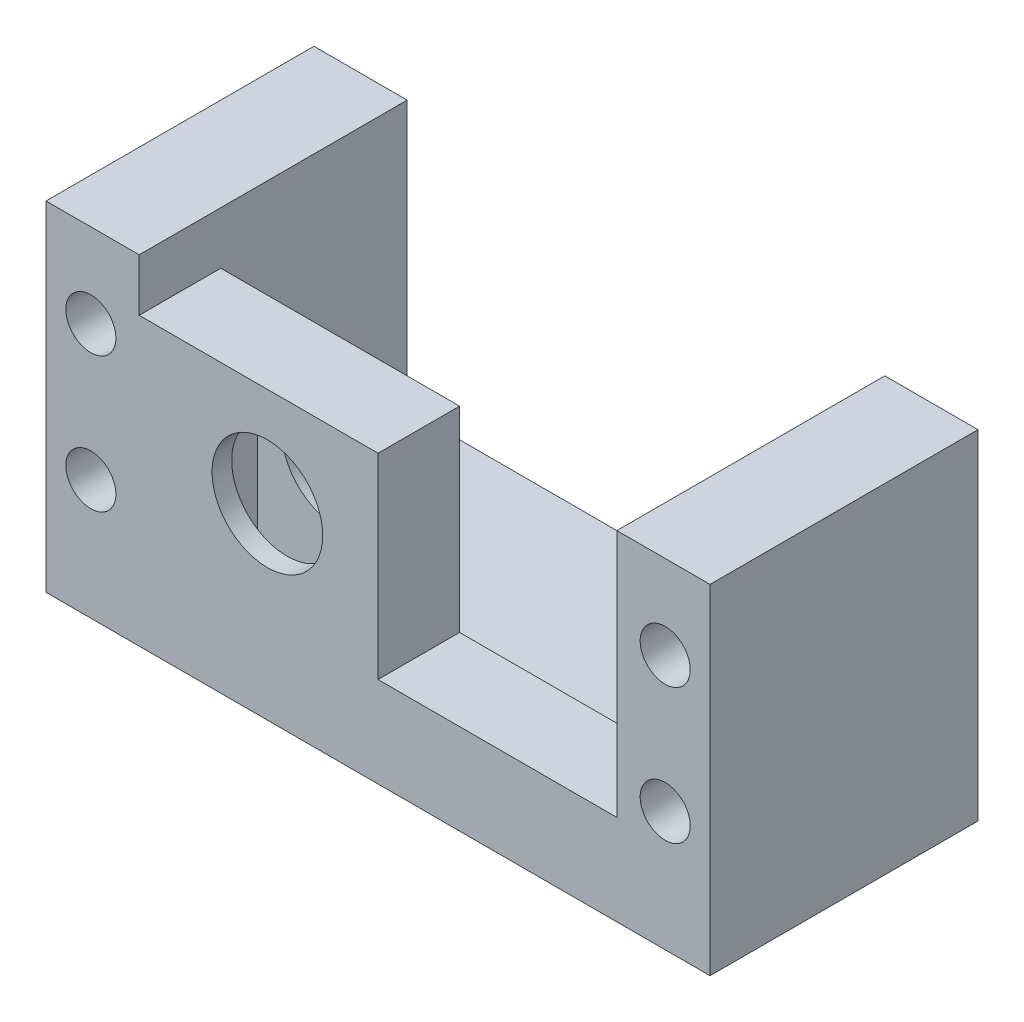
ISO-10303-21;
HEADER;
FILE_DESCRIPTION(('STEP AP214'),'2;1');
FILE_NAME('part.step','',(''),(''),'','','');
FILE_SCHEMA(('AUTOMOTIVE_DESIGN { 1 0 10303 214 1 1 1 1 }'));
ENDSEC;
DATA;
#1=APPLICATION_CONTEXT('core data for automotive mechanical design processes');
#2=APPLICATION_PROTOCOL_DEFINITION('international standard','automotive_design',2000,#1);
#3=PRODUCT_CONTEXT('',#1,'mechanical');
#4=PRODUCT('Part','Part','',(#3));
#5=PRODUCT_RELATED_PRODUCT_CATEGORY('part','',(#4));
#6=PRODUCT_DEFINITION_FORMATION('','',#4);
#7=PRODUCT_DEFINITION_CONTEXT('part definition',#1,'design');
#8=PRODUCT_DEFINITION('design','',#6,#7);
#9=PRODUCT_DEFINITION_SHAPE('','',#8);
#10=(LENGTH_UNIT() NAMED_UNIT(*) SI_UNIT(.MILLI.,.METRE.));
#11=(NAMED_UNIT(*) PLANE_ANGLE_UNIT() SI_UNIT($,.RADIAN.));
#12=(NAMED_UNIT(*) SI_UNIT($,.STERADIAN.) SOLID_ANGLE_UNIT());
#13=UNCERTAINTY_MEASURE_WITH_UNIT(LENGTH_MEASURE(1.E-05),#10,'distance_accuracy_value','');
#14=(GEOMETRIC_REPRESENTATION_CONTEXT(3) GLOBAL_UNCERTAINTY_ASSIGNED_CONTEXT((#13)) GLOBAL_UNIT_ASSIGNED_CONTEXT((#10,
#11,#12)) REPRESENTATION_CONTEXT('',''));
#15=CARTESIAN_POINT('',(0.,0.,0.));
#16=DIRECTION('',(0.,0.,1.));
#17=DIRECTION('',(1.,0.,0.));
#18=AXIS2_PLACEMENT_3D('',#15,#16,#17);
#19=CARTESIAN_POINT('',(-40.1905617977528,-28.0857303370787,16.));
#20=DIRECTION('',(0.,0.,1.));
#21=DIRECTION('',(1.,0.,0.));
#22=AXIS2_PLACEMENT_3D('',#19,#20,#21);
#23=CYLINDRICAL_SURFACE('',#22,4.75);
#24=CARTESIAN_POINT('',(-40.1905617977528,-28.0857303370787,21.3128854980334));
#25=DIRECTION('',(0.,0.,1.));
#26=DIRECTION('',(1.,0.,0.));
#27=AXIS2_PLACEMENT_3D('',#24,#25,#26);
#28=CIRCLE('',#27,4.75);
#29=CARTESIAN_POINT('',(-35.4405617977528,-28.0857303370787,21.3128854980334));
#30=VERTEX_POINT('',#29);
#31=EDGE_CURVE('E37',#30,#30,#28,.F.);
#32=ORIENTED_EDGE('',*,*,#31,.T.);
#33=EDGE_LOOP('',(#32));
#34=FACE_BOUND('',#33,.T.);
#35=CARTESIAN_POINT('',(-40.1905617977528,-28.0857303370787,23.));
#36=DIRECTION('',(0.,0.,1.));
#37=DIRECTION('',(-1.,0.,0.));
#38=AXIS2_PLACEMENT_3D('',#35,#36,#37);
#39=CIRCLE('',#38,4.75);
#40=CARTESIAN_POINT('',(-44.9405617977528,-28.0857303370787,23.));
#41=VERTEX_POINT('',#40);
#42=EDGE_CURVE('E225',#41,#41,#39,.T.);
#43=ORIENTED_EDGE('',*,*,#42,.T.);
#44=EDGE_LOOP('',(#43));
#45=FACE_BOUND('',#44,.T.);
#46=ADVANCED_FACE('F33',(#34,#45),#23,.F.);
#47=CARTESIAN_POINT('',(0.,0.,23.));
#48=DIRECTION('',(0.,0.,1.));
#49=DIRECTION('',(1.,0.,0.));
#50=AXIS2_PLACEMENT_3D('',#47,#48,#49);
#51=PLANE('',#50);
#52=DIRECTION('',(0.,-1.,0.));
#53=VECTOR('',#52,1.);
#54=CARTESIAN_POINT('',(-10.1905617977528,-15.0857303370787,23.));
#55=LINE('',#54,#53);
#56=CARTESIAN_POINT('',(-10.1905617977528,-15.0857303370787,23.));
#57=VERTEX_POINT('',#56);
#58=CARTESIAN_POINT('',(-10.1905617977528,-36.4088158931472,23.));
#59=VERTEX_POINT('',#58);
#60=EDGE_CURVE('E253',#57,#59,#55,.T.);
#61=ORIENTED_EDGE('',*,*,#60,.T.);
#62=DIRECTION('',(1.,0.,0.));
#63=VECTOR('',#62,1.);
#64=CARTESIAN_POINT('',(-10.1905617977528,-36.4088158931472,23.));
#65=LINE('',#64,#63);
#66=CARTESIAN_POINT('',(-30.6905617977528,-36.4088158931472,23.));
#67=VERTEX_POINT('',#66);
#68=EDGE_CURVE('E196',#67,#59,#65,.T.);
#69=ORIENTED_EDGE('',*,*,#68,.F.);
#70=DIRECTION('',(0.,-1.,0.));
#71=VECTOR('',#70,1.);
#72=CARTESIAN_POINT('',(-30.6905617977528,-19.58573034,23.));
#73=LINE('',#72,#71);
#74=CARTESIAN_POINT('',(-30.6905617977528,-19.58573034,23.));
#75=VERTEX_POINT('',#74);
#76=EDGE_CURVE('E194',#75,#67,#73,.T.);
#77=ORIENTED_EDGE('',*,*,#76,.F.);
#78=DIRECTION('',(-1.,0.,0.));
#79=VECTOR('',#78,1.);
#80=CARTESIAN_POINT('',(-21.1905617977528,-19.58573034,23.));
#81=LINE('',#80,#79);
#82=CARTESIAN_POINT('',(-51.1905617977528,-19.58573034,23.));
#83=VERTEX_POINT('',#82);
#84=EDGE_CURVE('E231',#75,#83,#81,.T.);
#85=ORIENTED_EDGE('',*,*,#84,.T.);
#86=DIRECTION('',(0.,1.,0.));
#87=VECTOR('',#86,1.);
#88=CARTESIAN_POINT('',(-51.1905617977528,-15.0857303370787,23.));
#89=LINE('',#88,#87);
#90=CARTESIAN_POINT('',(-51.1905617977528,-15.0857303370787,23.));
#91=VERTEX_POINT('',#90);
#92=EDGE_CURVE('E256',#83,#91,#89,.T.);
#93=ORIENTED_EDGE('',*,*,#92,.T.);
#94=DIRECTION('',(-1.,0.,0.));
#95=VECTOR('',#94,1.);
#96=CARTESIAN_POINT('',(-59.1905617977528,-15.0857303370787,23.));
#97=LINE('',#96,#95);
#98=CARTESIAN_POINT('',(-59.1905617977528,-15.0857303370787,23.));
#99=VERTEX_POINT('',#98);
#100=EDGE_CURVE('E258',#91,#99,#97,.T.);
#101=ORIENTED_EDGE('',*,*,#100,.T.);
#102=DIRECTION('',(0.,-1.,0.));
#103=VECTOR('',#102,1.);
#104=CARTESIAN_POINT('',(-59.1905617977528,-40.176897726885,23.));
#105=LINE('',#104,#103);
#106=CARTESIAN_POINT('',(-59.1905617977528,-44.176897726885,23.));
#107=VERTEX_POINT('',#106);
#108=EDGE_CURVE('E260',#99,#107,#105,.T.);
#109=ORIENTED_EDGE('',*,*,#108,.T.);
#110=DIRECTION('',(1.,0.,0.));
#111=VECTOR('',#110,1.);
#112=CARTESIAN_POINT('',(-59.1905617977528,-44.176897726885,23.));
#113=LINE('',#112,#111);
#114=CARTESIAN_POINT('',(-2.19056179775284,-44.176897726885,23.));
#115=VERTEX_POINT('',#114);
#116=EDGE_CURVE('E262',#107,#115,#113,.T.);
#117=ORIENTED_EDGE('',*,*,#116,.T.);
#118=DIRECTION('',(0.,1.,0.));
#119=VECTOR('',#118,1.);
#120=CARTESIAN_POINT('',(-2.19056179775284,-44.176897726885,23.));
#121=LINE('',#120,#119);
#122=CARTESIAN_POINT('',(-2.19056179775284,-15.0857303370787,23.));
#123=VERTEX_POINT('',#122);
#124=EDGE_CURVE('E264',#115,#123,#121,.T.);
#125=ORIENTED_EDGE('',*,*,#124,.T.);
#126=DIRECTION('',(-1.,0.,0.));
#127=VECTOR('',#126,1.);
#128=CARTESIAN_POINT('',(-2.19056179775284,-15.0857303370787,23.));
#129=LINE('',#128,#127);
#130=EDGE_CURVE('E250',#123,#57,#129,.T.);
#131=ORIENTED_EDGE('',*,*,#130,.T.);
#132=EDGE_LOOP('',(#61,#69,#77,#85,#93,#101,#109,#117,#125,#131));
#133=FACE_BOUND('',#132,.T.);
#134=CARTESIAN_POINT('',(-6.04056179775284,-22.2857303370787,23.));
#135=DIRECTION('',(0.,0.,1.));
#136=DIRECTION('',(1.,0.,0.));
#137=AXIS2_PLACEMENT_3D('',#134,#135,#136);
#138=CIRCLE('',#137,2.15);
#139=CARTESIAN_POINT('',(-3.89056179775284,-22.2857303370787,23.));
#140=VERTEX_POINT('',#139);
#141=EDGE_CURVE('E214',#140,#140,#138,.T.);
#142=ORIENTED_EDGE('',*,*,#141,.F.);
#143=EDGE_LOOP('',(#142));
#144=FACE_BOUND('',#143,.T.);
#145=CARTESIAN_POINT('',(-55.3405617977528,-22.2857303370787,23.));
#146=DIRECTION('',(0.,0.,1.));
#147=DIRECTION('',(1.,0.,0.));
#148=AXIS2_PLACEMENT_3D('',#145,#146,#147);
#149=CIRCLE('',#148,2.15);
#150=CARTESIAN_POINT('',(-53.1905617977528,-22.2857303370787,23.));
#151=VERTEX_POINT('',#150);
#152=EDGE_CURVE('E193',#151,#151,#149,.F.);
#153=ORIENTED_EDGE('',*,*,#152,.T.);
#154=EDGE_LOOP('',(#153));
#155=FACE_BOUND('',#154,.T.);
#156=CARTESIAN_POINT('',(-6.04056179775284,-33.8857303370787,23.));
#157=DIRECTION('',(0.,0.,1.));
#158=DIRECTION('',(1.,0.,0.));
#159=AXIS2_PLACEMENT_3D('',#156,#157,#158);
#160=CIRCLE('',#159,2.15);
#161=CARTESIAN_POINT('',(-3.89056179775284,-33.8857303370787,23.));
#162=VERTEX_POINT('',#161);
#163=EDGE_CURVE('E213',#162,#162,#160,.T.);
#164=ORIENTED_EDGE('',*,*,#163,.F.);
#165=EDGE_LOOP('',(#164));
#166=FACE_BOUND('',#165,.T.);
#167=ORIENTED_EDGE('',*,*,#42,.F.);
#168=EDGE_LOOP('',(#167));
#169=FACE_BOUND('',#168,.T.);
#170=CARTESIAN_POINT('',(-55.3405617977528,-33.8857303370787,23.));
#171=DIRECTION('',(0.,0.,1.));
#172=DIRECTION('',(1.,0.,0.));
#173=AXIS2_PLACEMENT_3D('',#170,#171,#172);
#174=CIRCLE('',#173,2.15);
#175=CARTESIAN_POINT('',(-53.1905617977528,-33.8857303370787,23.));
#176=VERTEX_POINT('',#175);
#177=EDGE_CURVE('E207',#176,#176,#174,.F.);
#178=ORIENTED_EDGE('',*,*,#177,.T.);
#179=EDGE_LOOP('',(#178));
#180=FACE_BOUND('',#179,.T.);
#181=ADVANCED_FACE('F325',(#133,#144,#155,#166,#169,#180),#51,.T.);
#182=CARTESIAN_POINT('',(0.,0.,0.));
#183=DIRECTION('',(0.,0.,1.));
#184=DIRECTION('',(1.,0.,0.));
#185=AXIS2_PLACEMENT_3D('',#182,#183,#184);
#186=PLANE('',#185);
#187=CARTESIAN_POINT('',(-6.04056179775284,-22.2857303370787,0.));
#188=DIRECTION('',(0.,0.,1.));
#189=DIRECTION('',(1.,0.,0.));
#190=AXIS2_PLACEMENT_3D('',#187,#188,#189);
#191=CIRCLE('',#190,2.15);
#192=CARTESIAN_POINT('',(-3.89056179775284,-22.2857303370787,0.));
#193=VERTEX_POINT('',#192);
#194=EDGE_CURVE('E210',#193,#193,#191,.T.);
#195=ORIENTED_EDGE('',*,*,#194,.T.);
#196=EDGE_LOOP('',(#195));
#197=FACE_BOUND('',#196,.T.);
#198=CARTESIAN_POINT('',(-6.04056179775284,-33.8857303370787,0.));
#199=DIRECTION('',(0.,0.,1.));
#200=DIRECTION('',(1.,0.,0.));
#201=AXIS2_PLACEMENT_3D('',#198,#199,#200);
#202=CIRCLE('',#201,2.15);
#203=CARTESIAN_POINT('',(-3.89056179775284,-33.8857303370787,0.));
#204=VERTEX_POINT('',#203);
#205=EDGE_CURVE('E222',#204,#204,#202,.T.);
#206=ORIENTED_EDGE('',*,*,#205,.T.);
#207=EDGE_LOOP('',(#206));
#208=FACE_BOUND('',#207,.T.);
#209=DIRECTION('',(-1.,0.,0.));
#210=VECTOR('',#209,1.);
#211=CARTESIAN_POINT('',(-2.19056179775284,-15.0857303370787,0.));
#212=LINE('',#211,#210);
#213=CARTESIAN_POINT('',(-2.19056179775284,-15.0857303370787,0.));
#214=VERTEX_POINT('',#213);
#215=CARTESIAN_POINT('',(-10.1905617977528,-15.0857303370787,0.));
#216=VERTEX_POINT('',#215);
#217=EDGE_CURVE('E249',#214,#216,#212,.T.);
#218=ORIENTED_EDGE('',*,*,#217,.F.);
#219=DIRECTION('',(0.,1.,0.));
#220=VECTOR('',#219,1.);
#221=CARTESIAN_POINT('',(-2.19056179775284,-38.0857303370787,0.));
#222=LINE('',#221,#220);
#223=CARTESIAN_POINT('',(-2.19056179775284,-44.176897726885,0.));
#224=VERTEX_POINT('',#223);
#225=EDGE_CURVE('E254',#224,#214,#222,.T.);
#226=ORIENTED_EDGE('',*,*,#225,.F.);
#227=DIRECTION('',(1.,0.,0.));
#228=VECTOR('',#227,1.);
#229=CARTESIAN_POINT('',(-59.1905617977528,-44.176897726885,0.));
#230=LINE('',#229,#228);
#231=CARTESIAN_POINT('',(-59.1905617977528,-44.176897726885,0.));
#232=VERTEX_POINT('',#231);
#233=EDGE_CURVE('E282',#232,#224,#230,.T.);
#234=ORIENTED_EDGE('',*,*,#233,.F.);
#235=DIRECTION('',(0.,-1.,0.));
#236=VECTOR('',#235,1.);
#237=CARTESIAN_POINT('',(-59.1905617977528,-40.176897726885,0.));
#238=LINE('',#237,#236);
#239=CARTESIAN_POINT('',(-59.1905617977528,-15.0857303370787,0.));
#240=VERTEX_POINT('',#239);
#241=EDGE_CURVE('E280',#240,#232,#238,.T.);
#242=ORIENTED_EDGE('',*,*,#241,.F.);
#243=DIRECTION('',(-1.,0.,0.));
#244=VECTOR('',#243,1.);
#245=CARTESIAN_POINT('',(-59.1905617977528,-15.0857303370787,0.));
#246=LINE('',#245,#244);
#247=CARTESIAN_POINT('',(-51.1905617977528,-15.0857303370787,0.));
#248=VERTEX_POINT('',#247);
#249=EDGE_CURVE('E277',#248,#240,#246,.T.);
#250=ORIENTED_EDGE('',*,*,#249,.F.);
#251=DIRECTION('',(0.,1.,0.));
#252=VECTOR('',#251,1.);
#253=CARTESIAN_POINT('',(-51.1905617977528,-15.0857303370787,0.));
#254=LINE('',#253,#252);
#255=CARTESIAN_POINT('',(-51.1905617977528,-38.0857303370787,0.));
#256=VERTEX_POINT('',#255);
#257=EDGE_CURVE('E275',#256,#248,#254,.T.);
#258=ORIENTED_EDGE('',*,*,#257,.F.);
#259=DIRECTION('',(-1.,0.,0.));
#260=VECTOR('',#259,1.);
#261=CARTESIAN_POINT('',(-51.1905617977528,-38.0857303370787,0.));
#262=LINE('',#261,#260);
#263=CARTESIAN_POINT('',(-10.1905617977528,-38.0857303370787,0.));
#264=VERTEX_POINT('',#263);
#265=EDGE_CURVE('E272',#264,#256,#262,.T.);
#266=ORIENTED_EDGE('',*,*,#265,.F.);
#267=DIRECTION('',(0.,-1.,0.));
#268=VECTOR('',#267,1.);
#269=CARTESIAN_POINT('',(-10.1905617977528,-15.0857303370787,0.));
#270=LINE('',#269,#268);
#271=EDGE_CURVE('E269',#216,#264,#270,.T.);
#272=ORIENTED_EDGE('',*,*,#271,.F.);
#273=EDGE_LOOP('',(#218,#226,#234,#242,#250,#258,#266,#272));
#274=FACE_BOUND('',#273,.T.);
#275=CARTESIAN_POINT('',(-55.3405617977528,-22.2857303370787,0.));
#276=DIRECTION('',(0.,0.,1.));
#277=DIRECTION('',(1.,0.,0.));
#278=AXIS2_PLACEMENT_3D('',#275,#276,#277);
#279=CIRCLE('',#278,2.15);
#280=CARTESIAN_POINT('',(-53.1905617977528,-22.2857303370787,0.));
#281=VERTEX_POINT('',#280);
#282=EDGE_CURVE('E204',#281,#281,#279,.F.);
#283=ORIENTED_EDGE('',*,*,#282,.F.);
#284=EDGE_LOOP('',(#283));
#285=FACE_BOUND('',#284,.T.);
#286=CARTESIAN_POINT('',(-55.3405617977528,-33.8857303370787,0.));
#287=DIRECTION('',(0.,0.,1.));
#288=DIRECTION('',(1.,0.,0.));
#289=AXIS2_PLACEMENT_3D('',#286,#287,#288);
#290=CIRCLE('',#289,2.15);
#291=CARTESIAN_POINT('',(-53.1905617977528,-33.8857303370787,0.));
#292=VERTEX_POINT('',#291);
#293=EDGE_CURVE('E217',#292,#292,#290,.F.);
#294=ORIENTED_EDGE('',*,*,#293,.F.);
#295=EDGE_LOOP('',(#294));
#296=FACE_BOUND('',#295,.T.);
#297=ADVANCED_FACE('F331',(#197,#208,#274,#285,#296),#186,.F.);
#298=CARTESIAN_POINT('',(-51.1905617977528,-38.0857303370787,23.));
#299=DIRECTION('',(0.,-1.,0.));
#300=DIRECTION('',(0.,0.,-1.));
#301=AXIS2_PLACEMENT_3D('',#298,#299,#300);
#302=PLANE('',#301);
#303=DIRECTION('',(1.,0.,0.));
#304=VECTOR('',#303,1.);
#305=CARTESIAN_POINT('',(-10.1905617977528,-38.0857303370787,16.));
#306=LINE('',#305,#304);
#307=CARTESIAN_POINT('',(-51.1905617977528,-38.0857303370787,16.));
#308=VERTEX_POINT('',#307);
#309=CARTESIAN_POINT('',(-10.1905617977528,-38.0857303370787,16.));
#310=VERTEX_POINT('',#309);
#311=EDGE_CURVE('E237',#308,#310,#306,.T.);
#312=ORIENTED_EDGE('',*,*,#311,.T.);
#313=DIRECTION('',(0.,0.,-1.));
#314=VECTOR('',#313,1.);
#315=CARTESIAN_POINT('',(-10.1905617977528,-38.0857303370787,23.));
#316=LINE('',#315,#314);
#317=EDGE_CURVE('E42',#310,#264,#316,.T.);
#318=ORIENTED_EDGE('',*,*,#317,.T.);
#319=ORIENTED_EDGE('',*,*,#265,.T.);
#320=DIRECTION('',(0.,0.,-1.));
#321=VECTOR('',#320,1.);
#322=CARTESIAN_POINT('',(-51.1905617977528,-38.0857303370787,23.));
#323=LINE('',#322,#321);
#324=EDGE_CURVE('E300',#308,#256,#323,.T.);
#325=ORIENTED_EDGE('',*,*,#324,.F.);
#326=EDGE_LOOP('',(#312,#318,#319,#325));
#327=FACE_BOUND('',#326,.T.);
#328=ADVANCED_FACE('F369',(#327),#302,.F.);
#329=CARTESIAN_POINT('',(-2.19056179775284,-15.0857303370787,23.));
#330=DIRECTION('',(0.,-1.,0.));
#331=DIRECTION('',(1.,0.,0.));
#332=AXIS2_PLACEMENT_3D('',#329,#330,#331);
#333=PLANE('',#332);
#334=ORIENTED_EDGE('',*,*,#217,.T.);
#335=DIRECTION('',(0.,0.,-1.));
#336=VECTOR('',#335,1.);
#337=CARTESIAN_POINT('',(-10.1905617977528,-15.0857303370787,23.));
#338=LINE('',#337,#336);
#339=EDGE_CURVE('E11',#57,#216,#338,.T.);
#340=ORIENTED_EDGE('',*,*,#339,.F.);
#341=ORIENTED_EDGE('',*,*,#130,.F.);
#342=DIRECTION('',(0.,0.,-1.));
#343=VECTOR('',#342,1.);
#344=CARTESIAN_POINT('',(-2.19056179775284,-15.0857303370787,23.));
#345=LINE('',#344,#343);
#346=EDGE_CURVE('E266',#123,#214,#345,.T.);
#347=ORIENTED_EDGE('',*,*,#346,.T.);
#348=EDGE_LOOP('',(#334,#340,#341,#347));
#349=FACE_BOUND('',#348,.T.);
#350=ADVANCED_FACE('F35',(#349),#333,.F.);
#351=CARTESIAN_POINT('',(-10.1905617977528,-15.0857303370787,23.));
#352=DIRECTION('',(1.,0.,0.));
#353=DIRECTION('',(0.,1.,0.));
#354=AXIS2_PLACEMENT_3D('',#351,#352,#353);
#355=PLANE('',#354);
#356=DIRECTION('',(0.,0.,1.));
#357=VECTOR('',#356,1.);
#358=CARTESIAN_POINT('',(-10.1905617977528,-36.4088158931472,-10.5191667955181));
#359=LINE('',#358,#357);
#360=CARTESIAN_POINT('',(-10.1905617977528,-36.4088158931472,16.));
#361=VERTEX_POINT('',#360);
#362=EDGE_CURVE('E191',#361,#59,#359,.T.);
#363=ORIENTED_EDGE('',*,*,#362,.T.);
#364=ORIENTED_EDGE('',*,*,#60,.F.);
#365=ORIENTED_EDGE('',*,*,#339,.T.);
#366=ORIENTED_EDGE('',*,*,#271,.T.);
#367=ORIENTED_EDGE('',*,*,#317,.F.);
#368=DIRECTION('',(0.,1.,0.));
#369=VECTOR('',#368,1.);
#370=CARTESIAN_POINT('',(-10.1905617977528,-38.0857303370787,16.));
#371=LINE('',#370,#369);
#372=EDGE_CURVE('E240',#310,#361,#371,.T.);
#373=ORIENTED_EDGE('',*,*,#372,.T.);
#374=EDGE_LOOP('',(#363,#364,#365,#366,#367,#373));
#375=FACE_BOUND('',#374,.T.);
#376=ADVANCED_FACE('F365',(#375),#355,.F.);
#377=CARTESIAN_POINT('',(-51.1905617977528,-15.0857303370787,23.));
#378=DIRECTION('',(-1.,0.,0.));
#379=DIRECTION('',(0.,-1.,0.));
#380=AXIS2_PLACEMENT_3D('',#377,#378,#379);
#381=PLANE('',#380);
#382=ORIENTED_EDGE('',*,*,#92,.F.);
#383=DIRECTION('',(0.,0.,1.));
#384=VECTOR('',#383,1.);
#385=CARTESIAN_POINT('',(-51.1905617977528,-19.58573034,16.));
#386=LINE('',#385,#384);
#387=CARTESIAN_POINT('',(-51.1905617977528,-19.58573034,16.));
#388=VERTEX_POINT('',#387);
#389=EDGE_CURVE('E245',#388,#83,#386,.T.);
#390=ORIENTED_EDGE('',*,*,#389,.F.);
#391=DIRECTION('',(0.,-1.,0.));
#392=VECTOR('',#391,1.);
#393=CARTESIAN_POINT('',(-51.1905617977528,-34.9839297426522,16.));
#394=LINE('',#393,#392);
#395=EDGE_CURVE('E234',#388,#308,#394,.T.);
#396=ORIENTED_EDGE('',*,*,#395,.T.);
#397=ORIENTED_EDGE('',*,*,#324,.T.);
#398=ORIENTED_EDGE('',*,*,#257,.T.);
#399=DIRECTION('',(0.,0.,-1.));
#400=VECTOR('',#399,1.);
#401=CARTESIAN_POINT('',(-51.1905617977528,-15.0857303370787,23.));
#402=LINE('',#401,#400);
#403=EDGE_CURVE('E297',#91,#248,#402,.T.);
#404=ORIENTED_EDGE('',*,*,#403,.F.);
#405=EDGE_LOOP('',(#382,#390,#396,#397,#398,#404));
#406=FACE_BOUND('',#405,.T.);
#407=ADVANCED_FACE('F373',(#406),#381,.F.);
#408=CARTESIAN_POINT('',(-59.1905617977528,-15.0857303370787,23.));
#409=DIRECTION('',(0.,-1.,0.));
#410=DIRECTION('',(0.,0.,-1.));
#411=AXIS2_PLACEMENT_3D('',#408,#409,#410);
#412=PLANE('',#411);
#413=ORIENTED_EDGE('',*,*,#249,.T.);
#414=DIRECTION('',(0.,0.,-1.));
#415=VECTOR('',#414,1.);
#416=CARTESIAN_POINT('',(-59.1905617977528,-15.0857303370787,23.));
#417=LINE('',#416,#415);
#418=EDGE_CURVE('E294',#99,#240,#417,.T.);
#419=ORIENTED_EDGE('',*,*,#418,.F.);
#420=ORIENTED_EDGE('',*,*,#100,.F.);
#421=ORIENTED_EDGE('',*,*,#403,.T.);
#422=EDGE_LOOP('',(#413,#419,#420,#421));
#423=FACE_BOUND('',#422,.T.);
#424=ADVANCED_FACE('F378',(#423),#412,.F.);
#425=CARTESIAN_POINT('',(-59.1905617977528,-40.176897726885,23.));
#426=DIRECTION('',(1.,0.,0.));
#427=DIRECTION('',(0.,0.,-1.));
#428=AXIS2_PLACEMENT_3D('',#425,#426,#427);
#429=PLANE('',#428);
#430=ORIENTED_EDGE('',*,*,#241,.T.);
#431=DIRECTION('',(0.,0.,-1.));
#432=VECTOR('',#431,1.);
#433=CARTESIAN_POINT('',(-59.1905617977528,-44.176897726885,23.));
#434=LINE('',#433,#432);
#435=EDGE_CURVE('E291',#107,#232,#434,.T.);
#436=ORIENTED_EDGE('',*,*,#435,.F.);
#437=ORIENTED_EDGE('',*,*,#108,.F.);
#438=ORIENTED_EDGE('',*,*,#418,.T.);
#439=EDGE_LOOP('',(#430,#436,#437,#438));
#440=FACE_BOUND('',#439,.T.);
#441=ADVANCED_FACE('F384',(#440),#429,.F.);
#442=CARTESIAN_POINT('',(-59.1905617977528,-44.176897726885,23.));
#443=DIRECTION('',(0.,1.,0.));
#444=DIRECTION('',(0.,0.,1.));
#445=AXIS2_PLACEMENT_3D('',#442,#443,#444);
#446=PLANE('',#445);
#447=DIRECTION('',(1.,0.,0.));
#448=VECTOR('',#447,1.);
#449=CARTESIAN_POINT('',(-33.427814591544,-44.176897726885,17.0128854980334));
#450=LINE('',#449,#448);
#451=CARTESIAN_POINT('',(-47.027814591544,-44.176897726885,17.0128854980334));
#452=VERTEX_POINT('',#451);
#453=CARTESIAN_POINT('',(-33.427814591544,-44.176897726885,17.0128854980334));
#454=VERTEX_POINT('',#453);
#455=EDGE_CURVE('E178',#452,#454,#450,.T.);
#456=ORIENTED_EDGE('',*,*,#455,.F.);
#457=DIRECTION('',(0.,0.,-1.));
#458=VECTOR('',#457,1.);
#459=CARTESIAN_POINT('',(-47.027814591544,-44.176897726885,21.3128854980334));
#460=LINE('',#459,#458);
#461=CARTESIAN_POINT('',(-47.027814591544,-44.176897726885,21.3128854980334));
#462=VERTEX_POINT('',#461);
#463=EDGE_CURVE('E50',#462,#452,#460,.T.);
#464=ORIENTED_EDGE('',*,*,#463,.F.);
#465=DIRECTION('',(-1.,0.,0.));
#466=VECTOR('',#465,1.);
#467=CARTESIAN_POINT('',(-33.427814591544,-44.176897726885,21.3128854980334));
#468=LINE('',#467,#466);
#469=CARTESIAN_POINT('',(-33.427814591544,-44.176897726885,21.3128854980334));
#470=VERTEX_POINT('',#469);
#471=EDGE_CURVE('E169',#470,#462,#468,.T.);
#472=ORIENTED_EDGE('',*,*,#471,.F.);
#473=DIRECTION('',(0.,0.,1.));
#474=VECTOR('',#473,1.);
#475=CARTESIAN_POINT('',(-33.427814591544,-44.176897726885,21.3128854980334));
#476=LINE('',#475,#474);
#477=EDGE_CURVE('E172',#454,#470,#476,.T.);
#478=ORIENTED_EDGE('',*,*,#477,.F.);
#479=EDGE_LOOP('',(#456,#464,#472,#478));
#480=FACE_BOUND('',#479,.T.);
#481=ORIENTED_EDGE('',*,*,#233,.T.);
#482=DIRECTION('',(0.,0.,-1.));
#483=VECTOR('',#482,1.);
#484=CARTESIAN_POINT('',(-2.19056179775284,-44.176897726885,23.));
#485=LINE('',#484,#483);
#486=EDGE_CURVE('E288',#115,#224,#485,.T.);
#487=ORIENTED_EDGE('',*,*,#486,.F.);
#488=ORIENTED_EDGE('',*,*,#116,.F.);
#489=ORIENTED_EDGE('',*,*,#435,.T.);
#490=EDGE_LOOP('',(#481,#487,#488,#489));
#491=FACE_BOUND('',#490,.T.);
#492=ADVANCED_FACE('F387',(#480,#491),#446,.F.);
#493=CARTESIAN_POINT('',(-2.19056179775284,-38.0857303370787,23.));
#494=DIRECTION('',(-1.,0.,0.));
#495=DIRECTION('',(0.,0.,1.));
#496=AXIS2_PLACEMENT_3D('',#493,#494,#495);
#497=PLANE('',#496);
#498=ORIENTED_EDGE('',*,*,#225,.T.);
#499=ORIENTED_EDGE('',*,*,#346,.F.);
#500=ORIENTED_EDGE('',*,*,#124,.F.);
#501=ORIENTED_EDGE('',*,*,#486,.T.);
#502=EDGE_LOOP('',(#498,#499,#500,#501));
#503=FACE_BOUND('',#502,.T.);
#504=ADVANCED_FACE('F391',(#503),#497,.F.);
#505=CARTESIAN_POINT('',(-21.1905617977528,-19.58573034,16.));
#506=DIRECTION('',(0.,1.,0.));
#507=DIRECTION('',(-1.,0.,0.));
#508=AXIS2_PLACEMENT_3D('',#505,#506,#507);
#509=PLANE('',#508);
#510=DIRECTION('',(0.,0.,1.));
#511=VECTOR('',#510,1.);
#512=CARTESIAN_POINT('',(-30.6905617977528,-19.58573034,-10.5191667955181));
#513=LINE('',#512,#511);
#514=CARTESIAN_POINT('',(-30.6905617977528,-19.58573034,16.));
#515=VERTEX_POINT('',#514);
#516=EDGE_CURVE('E199',#515,#75,#513,.T.);
#517=ORIENTED_EDGE('',*,*,#516,.F.);
#518=DIRECTION('',(-1.,0.,0.));
#519=VECTOR('',#518,1.);
#520=CARTESIAN_POINT('',(-21.1905617977528,-19.58573034,16.));
#521=LINE('',#520,#519);
#522=EDGE_CURVE('E243',#515,#388,#521,.T.);
#523=ORIENTED_EDGE('',*,*,#522,.T.);
#524=ORIENTED_EDGE('',*,*,#389,.T.);
#525=ORIENTED_EDGE('',*,*,#84,.F.);
#526=EDGE_LOOP('',(#517,#523,#524,#525));
#527=FACE_BOUND('',#526,.T.);
#528=ADVANCED_FACE('F345',(#527),#509,.T.);
#529=CARTESIAN_POINT('',(0.,0.,16.));
#530=DIRECTION('',(0.,0.,1.));
#531=DIRECTION('',(1.,0.,0.));
#532=AXIS2_PLACEMENT_3D('',#529,#530,#531);
#533=PLANE('',#532);
#534=CARTESIAN_POINT('',(-40.1905617977528,-28.0857303370787,16.));
#535=DIRECTION('',(0.,0.,1.));
#536=DIRECTION('',(-1.,0.,0.));
#537=AXIS2_PLACEMENT_3D('',#534,#535,#536);
#538=CIRCLE('',#537,4.75);
#539=CARTESIAN_POINT('',(-44.9405617977528,-28.0857303370787,16.));
#540=VERTEX_POINT('',#539);
#541=EDGE_CURVE('E228',#540,#540,#538,.T.);
#542=ORIENTED_EDGE('',*,*,#541,.T.);
#543=EDGE_LOOP('',(#542));
#544=FACE_BOUND('',#543,.T.);
#545=DIRECTION('',(0.,1.,0.));
#546=VECTOR('',#545,1.);
#547=CARTESIAN_POINT('',(-30.6905617977528,-19.58573034,16.));
#548=LINE('',#547,#546);
#549=CARTESIAN_POINT('',(-30.6905617977528,-36.4088158931472,16.));
#550=VERTEX_POINT('',#549);
#551=EDGE_CURVE('E188',#550,#515,#548,.T.);
#552=ORIENTED_EDGE('',*,*,#551,.F.);
#553=DIRECTION('',(-1.,0.,0.));
#554=VECTOR('',#553,1.);
#555=CARTESIAN_POINT('',(-10.1905617977528,-36.4088158931472,16.));
#556=LINE('',#555,#554);
#557=EDGE_CURVE('E190',#361,#550,#556,.T.);
#558=ORIENTED_EDGE('',*,*,#557,.F.);
#559=ORIENTED_EDGE('',*,*,#372,.F.);
#560=ORIENTED_EDGE('',*,*,#311,.F.);
#561=ORIENTED_EDGE('',*,*,#395,.F.);
#562=ORIENTED_EDGE('',*,*,#522,.F.);
#563=EDGE_LOOP('',(#552,#558,#559,#560,#561,#562));
#564=FACE_BOUND('',#563,.T.);
#565=ADVANCED_FACE('F338',(#544,#564),#533,.F.);
#566=CARTESIAN_POINT('',(-40.1905617977528,-28.0857303370787,17.0128854980334));
#567=DIRECTION('',(0.,0.,-1.));
#568=DIRECTION('',(-1.,0.,0.));
#569=AXIS2_PLACEMENT_3D('',#566,#567,#568);
#570=CIRCLE('',#569,4.75);
#571=CARTESIAN_POINT('',(-44.9405617977528,-28.0857303370787,17.0128854980334));
#572=VERTEX_POINT('',#571);
#573=EDGE_CURVE('E184',#572,#572,#570,.F.);
#574=ORIENTED_EDGE('',*,*,#573,.T.);
#575=EDGE_LOOP('',(#574));
#576=FACE_BOUND('',#575,.T.);
#577=ORIENTED_EDGE('',*,*,#541,.F.);
#578=EDGE_LOOP('',(#577));
#579=FACE_BOUND('',#578,.T.);
#580=ADVANCED_FACE('F327',(#576,#579),#23,.F.);
#581=CARTESIAN_POINT('',(-6.04056179775284,-33.8857303370787,0.));
#582=DIRECTION('',(0.,0.,1.));
#583=DIRECTION('',(1.,0.,0.));
#584=AXIS2_PLACEMENT_3D('',#581,#582,#583);
#585=CYLINDRICAL_SURFACE('',#584,2.15);
#586=ORIENTED_EDGE('',*,*,#205,.F.);
#587=EDGE_LOOP('',(#586));
#588=FACE_BOUND('',#587,.T.);
#589=ORIENTED_EDGE('',*,*,#163,.T.);
#590=EDGE_LOOP('',(#589));
#591=FACE_BOUND('',#590,.T.);
#592=ADVANCED_FACE('F337',(#588,#591),#585,.F.);
#593=CARTESIAN_POINT('',(-55.3405617977528,-22.2857303370787,0.));
#594=DIRECTION('',(0.,0.,1.));
#595=DIRECTION('',(1.,0.,0.));
#596=AXIS2_PLACEMENT_3D('',#593,#594,#595);
#597=CYLINDRICAL_SURFACE('',#596,2.15);
#598=ORIENTED_EDGE('',*,*,#282,.T.);
#599=EDGE_LOOP('',(#598));
#600=FACE_BOUND('',#599,.T.);
#601=ORIENTED_EDGE('',*,*,#152,.F.);
#602=EDGE_LOOP('',(#601));
#603=FACE_BOUND('',#602,.T.);
#604=ADVANCED_FACE('F343',(#600,#603),#597,.F.);
#605=CARTESIAN_POINT('',(-55.3405617977528,-33.8857303370787,0.));
#606=DIRECTION('',(0.,0.,1.));
#607=DIRECTION('',(1.,0.,0.));
#608=AXIS2_PLACEMENT_3D('',#605,#606,#607);
#609=CYLINDRICAL_SURFACE('',#608,2.15);
#610=ORIENTED_EDGE('',*,*,#293,.T.);
#611=EDGE_LOOP('',(#610));
#612=FACE_BOUND('',#611,.T.);
#613=ORIENTED_EDGE('',*,*,#177,.F.);
#614=EDGE_LOOP('',(#613));
#615=FACE_BOUND('',#614,.T.);
#616=ADVANCED_FACE('F405',(#612,#615),#609,.F.);
#617=CARTESIAN_POINT('',(-6.04056179775284,-22.2857303370787,0.));
#618=DIRECTION('',(0.,0.,1.));
#619=DIRECTION('',(1.,0.,0.));
#620=AXIS2_PLACEMENT_3D('',#617,#618,#619);
#621=CYLINDRICAL_SURFACE('',#620,2.15);
#622=ORIENTED_EDGE('',*,*,#194,.F.);
#623=EDGE_LOOP('',(#622));
#624=FACE_BOUND('',#623,.T.);
#625=ORIENTED_EDGE('',*,*,#141,.T.);
#626=EDGE_LOOP('',(#625));
#627=FACE_BOUND('',#626,.T.);
#628=ADVANCED_FACE('F408',(#624,#627),#621,.F.);
#629=CARTESIAN_POINT('',(-10.1905617977528,-36.4088158931472,-10.5191667955181));
#630=DIRECTION('',(0.,-1.,0.));
#631=DIRECTION('',(0.,0.,-1.));
#632=AXIS2_PLACEMENT_3D('',#629,#630,#631);
#633=PLANE('',#632);
#634=ORIENTED_EDGE('',*,*,#557,.T.);
#635=DIRECTION('',(0.,0.,1.));
#636=VECTOR('',#635,1.);
#637=CARTESIAN_POINT('',(-30.6905617977528,-36.4088158931472,-10.5191667955181));
#638=LINE('',#637,#636);
#639=EDGE_CURVE('E58',#550,#67,#638,.T.);
#640=ORIENTED_EDGE('',*,*,#639,.T.);
#641=ORIENTED_EDGE('',*,*,#68,.T.);
#642=ORIENTED_EDGE('',*,*,#362,.F.);
#643=EDGE_LOOP('',(#634,#640,#641,#642));
#644=FACE_BOUND('',#643,.T.);
#645=ADVANCED_FACE('F320',(#644),#633,.F.);
#646=CARTESIAN_POINT('',(-30.6905617977528,-19.58573034,-10.5191667955181));
#647=DIRECTION('',(-1.,0.,0.));
#648=DIRECTION('',(0.,0.,1.));
#649=AXIS2_PLACEMENT_3D('',#646,#647,#648);
#650=PLANE('',#649);
#651=ORIENTED_EDGE('',*,*,#551,.T.);
#652=ORIENTED_EDGE('',*,*,#516,.T.);
#653=ORIENTED_EDGE('',*,*,#76,.T.);
#654=ORIENTED_EDGE('',*,*,#639,.F.);
#655=EDGE_LOOP('',(#651,#652,#653,#654));
#656=FACE_BOUND('',#655,.T.);
#657=ADVANCED_FACE('F312',(#656),#650,.F.);
#658=CARTESIAN_POINT('',(-33.427814591544,-21.436897726885,21.3128854980334));
#659=DIRECTION('',(0.,0.,1.));
#660=DIRECTION('',(1.,0.,0.));
#661=AXIS2_PLACEMENT_3D('',#658,#659,#660);
#662=PLANE('',#661);
#663=ORIENTED_EDGE('',*,*,#471,.T.);
#664=DIRECTION('',(0.,-1.,0.));
#665=VECTOR('',#664,1.);
#666=CARTESIAN_POINT('',(-47.027814591544,-21.436897726885,21.3128854980334));
#667=LINE('',#666,#665);
#668=CARTESIAN_POINT('',(-47.027814591544,-21.436897726885,21.3128854980334));
#669=VERTEX_POINT('',#668);
#670=EDGE_CURVE('E182',#669,#462,#667,.T.);
#671=ORIENTED_EDGE('',*,*,#670,.F.);
#672=DIRECTION('',(-1.,0.,0.));
#673=VECTOR('',#672,1.);
#674=CARTESIAN_POINT('',(-33.427814591544,-21.436897726885,21.3128854980334));
#675=LINE('',#674,#673);
#676=CARTESIAN_POINT('',(-33.427814591544,-21.436897726885,21.3128854980334));
#677=VERTEX_POINT('',#676);
#678=EDGE_CURVE('E156',#677,#669,#675,.T.);
#679=ORIENTED_EDGE('',*,*,#678,.F.);
#680=DIRECTION('',(0.,-1.,0.));
#681=VECTOR('',#680,1.);
#682=CARTESIAN_POINT('',(-33.427814591544,-21.436897726885,21.3128854980334));
#683=LINE('',#682,#681);
#684=EDGE_CURVE('E185',#677,#470,#683,.T.);
#685=ORIENTED_EDGE('',*,*,#684,.T.);
#686=EDGE_LOOP('',(#663,#671,#679,#685));
#687=FACE_BOUND('',#686,.T.);
#688=ORIENTED_EDGE('',*,*,#31,.F.);
#689=EDGE_LOOP('',(#688));
#690=FACE_BOUND('',#689,.T.);
#691=ADVANCED_FACE('F310',(#687,#690),#662,.F.);
#692=CARTESIAN_POINT('',(-33.427814591544,-21.436897726885,17.0128854980334));
#693=DIRECTION('',(0.,0.,-1.));
#694=DIRECTION('',(-1.,0.,0.));
#695=AXIS2_PLACEMENT_3D('',#692,#693,#694);
#696=PLANE('',#695);
#697=ORIENTED_EDGE('',*,*,#455,.T.);
#698=DIRECTION('',(0.,-1.,0.));
#699=VECTOR('',#698,1.);
#700=CARTESIAN_POINT('',(-33.427814591544,-21.436897726885,17.0128854980334));
#701=LINE('',#700,#699);
#702=CARTESIAN_POINT('',(-33.427814591544,-21.436897726885,17.0128854980334));
#703=VERTEX_POINT('',#702);
#704=EDGE_CURVE('E155',#703,#454,#701,.T.);
#705=ORIENTED_EDGE('',*,*,#704,.F.);
#706=DIRECTION('',(1.,0.,0.));
#707=VECTOR('',#706,1.);
#708=CARTESIAN_POINT('',(-33.427814591544,-21.436897726885,17.0128854980334));
#709=LINE('',#708,#707);
#710=CARTESIAN_POINT('',(-47.027814591544,-21.436897726885,17.0128854980334));
#711=VERTEX_POINT('',#710);
#712=EDGE_CURVE('E159',#711,#703,#709,.T.);
#713=ORIENTED_EDGE('',*,*,#712,.F.);
#714=DIRECTION('',(0.,-1.,0.));
#715=VECTOR('',#714,1.);
#716=CARTESIAN_POINT('',(-47.027814591544,-21.436897726885,17.0128854980334));
#717=LINE('',#716,#715);
#718=EDGE_CURVE('E146',#711,#452,#717,.T.);
#719=ORIENTED_EDGE('',*,*,#718,.T.);
#720=EDGE_LOOP('',(#697,#705,#713,#719));
#721=FACE_BOUND('',#720,.T.);
#722=ORIENTED_EDGE('',*,*,#573,.F.);
#723=EDGE_LOOP('',(#722));
#724=FACE_BOUND('',#723,.T.);
#725=ADVANCED_FACE('F160',(#721,#724),#696,.F.);
#726=CARTESIAN_POINT('',(-47.027814591544,-21.436897726885,21.3128854980334));
#727=DIRECTION('',(-1.,0.,0.));
#728=DIRECTION('',(0.,0.,1.));
#729=AXIS2_PLACEMENT_3D('',#726,#727,#728);
#730=PLANE('',#729);
#731=ORIENTED_EDGE('',*,*,#463,.T.);
#732=ORIENTED_EDGE('',*,*,#718,.F.);
#733=DIRECTION('',(0.,0.,-1.));
#734=VECTOR('',#733,1.);
#735=CARTESIAN_POINT('',(-47.027814591544,-21.436897726885,21.3128854980334));
#736=LINE('',#735,#734);
#737=EDGE_CURVE('E150',#669,#711,#736,.T.);
#738=ORIENTED_EDGE('',*,*,#737,.F.);
#739=ORIENTED_EDGE('',*,*,#670,.T.);
#740=EDGE_LOOP('',(#731,#732,#738,#739));
#741=FACE_BOUND('',#740,.T.);
#742=ADVANCED_FACE('F148',(#741),#730,.F.);
#743=CARTESIAN_POINT('',(-33.427814591544,-21.436897726885,21.3128854980334));
#744=DIRECTION('',(1.,0.,0.));
#745=DIRECTION('',(0.,0.,-1.));
#746=AXIS2_PLACEMENT_3D('',#743,#744,#745);
#747=PLANE('',#746);
#748=ORIENTED_EDGE('',*,*,#477,.T.);
#749=ORIENTED_EDGE('',*,*,#684,.F.);
#750=DIRECTION('',(0.,0.,1.));
#751=VECTOR('',#750,1.);
#752=CARTESIAN_POINT('',(-33.427814591544,-21.436897726885,21.3128854980334));
#753=LINE('',#752,#751);
#754=EDGE_CURVE('E165',#703,#677,#753,.T.);
#755=ORIENTED_EDGE('',*,*,#754,.F.);
#756=ORIENTED_EDGE('',*,*,#704,.T.);
#757=EDGE_LOOP('',(#748,#749,#755,#756));
#758=FACE_BOUND('',#757,.T.);
#759=ADVANCED_FACE('F424',(#758),#747,.F.);
#760=CARTESIAN_POINT('',(0.,-21.436897726885,0.));
#761=DIRECTION('',(0.,1.,0.));
#762=DIRECTION('',(0.,0.,1.));
#763=AXIS2_PLACEMENT_3D('',#760,#761,#762);
#764=PLANE('',#763);
#765=ORIENTED_EDGE('',*,*,#737,.T.);
#766=ORIENTED_EDGE('',*,*,#712,.T.);
#767=ORIENTED_EDGE('',*,*,#754,.T.);
#768=ORIENTED_EDGE('',*,*,#678,.T.);
#769=EDGE_LOOP('',(#765,#766,#767,#768));
#770=FACE_BOUND('',#769,.T.);
#771=ADVANCED_FACE('F167',(#770),#764,.F.);
#772=CLOSED_SHELL('',(#46,#181,#297,#328,#350,#376,#407,#424,#441,#492,#504,#528,#565,#580,#592,
#604,#616,#628,#645,#657,#691,#725,#742,#759,#771));
#773=MANIFOLD_SOLID_BREP('B2',#772);
#774=ADVANCED_BREP_SHAPE_REPRESENTATION('',(#18,#773),#14);
#775=SHAPE_DEFINITION_REPRESENTATION(#9,#774);
ENDSEC;
END-ISO-10303-21;
